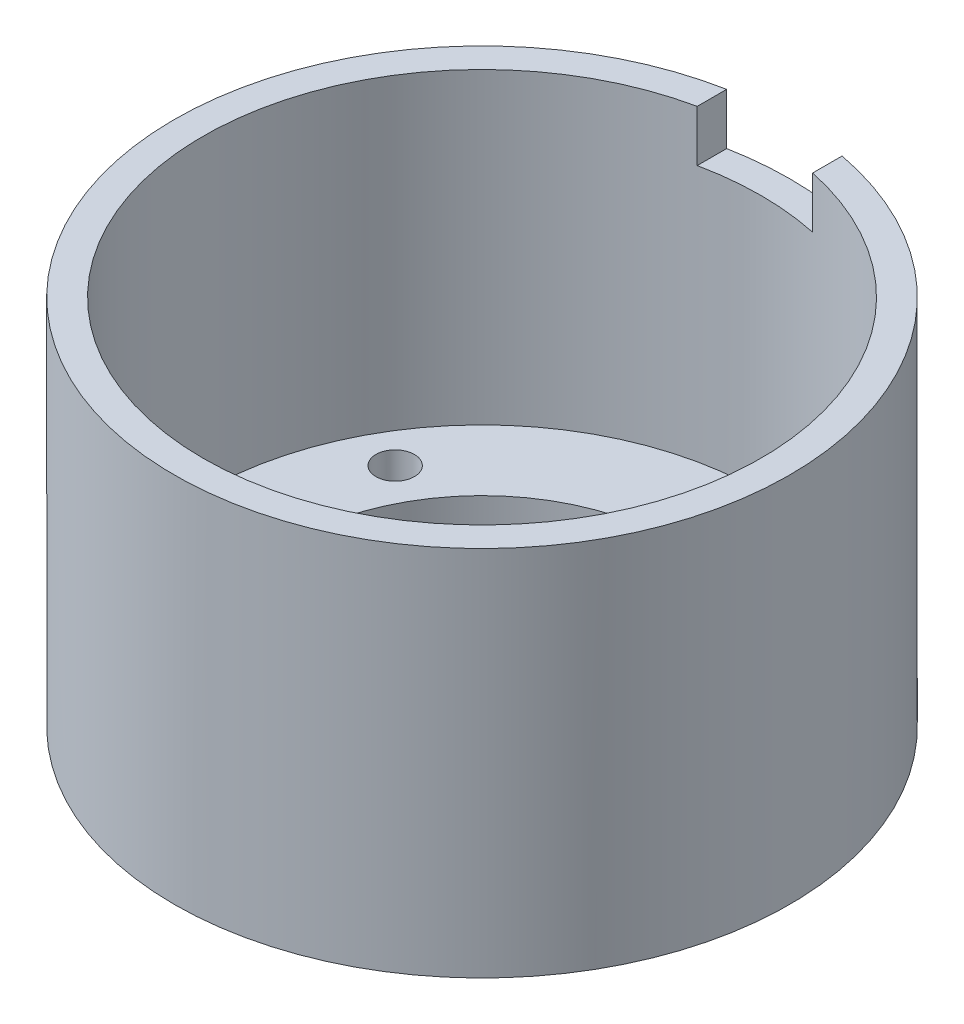
ISO-10303-21;
HEADER;
FILE_DESCRIPTION(('STEP AP214'),'2;1');
FILE_NAME('part.step','',(''),(''),'','','');
FILE_SCHEMA(('AUTOMOTIVE_DESIGN { 1 0 10303 214 1 1 1 1 }'));
ENDSEC;
DATA;
#1=APPLICATION_CONTEXT('core data for automotive mechanical design processes');
#2=APPLICATION_PROTOCOL_DEFINITION('international standard','automotive_design',2000,#1);
#3=PRODUCT_CONTEXT('',#1,'mechanical');
#4=PRODUCT('Part','Part','',(#3));
#5=PRODUCT_RELATED_PRODUCT_CATEGORY('part','',(#4));
#6=PRODUCT_DEFINITION_FORMATION('','',#4);
#7=PRODUCT_DEFINITION_CONTEXT('part definition',#1,'design');
#8=PRODUCT_DEFINITION('design','',#6,#7);
#9=PRODUCT_DEFINITION_SHAPE('','',#8);
#10=(LENGTH_UNIT() NAMED_UNIT(*) SI_UNIT(.MILLI.,.METRE.));
#11=(NAMED_UNIT(*) PLANE_ANGLE_UNIT() SI_UNIT($,.RADIAN.));
#12=(NAMED_UNIT(*) SI_UNIT($,.STERADIAN.) SOLID_ANGLE_UNIT());
#13=UNCERTAINTY_MEASURE_WITH_UNIT(LENGTH_MEASURE(1.E-05),#10,'distance_accuracy_value','');
#14=(GEOMETRIC_REPRESENTATION_CONTEXT(3) GLOBAL_UNCERTAINTY_ASSIGNED_CONTEXT((#13)) GLOBAL_UNIT_ASSIGNED_CONTEXT((#10,
#11,#12)) REPRESENTATION_CONTEXT('',''));
#15=CARTESIAN_POINT('',(0.,0.,0.));
#16=DIRECTION('',(0.,0.,1.));
#17=DIRECTION('',(1.,0.,0.));
#18=AXIS2_PLACEMENT_3D('',#15,#16,#17);
#19=CARTESIAN_POINT('',(0.,24.,0.));
#20=DIRECTION('',(0.,1.,0.));
#21=DIRECTION('',(0.,0.,1.));
#22=AXIS2_PLACEMENT_3D('',#19,#20,#21);
#23=PLANE('',#22);
#24=DIRECTION('',(0.,0.,-1.));
#25=VECTOR('',#24,1.);
#26=CARTESIAN_POINT('',(-4.5,24.,24.001));
#27=LINE('',#26,#25);
#28=CARTESIAN_POINT('',(-4.5,24.,-21.2793914386667));
#29=VERTEX_POINT('',#28);
#30=CARTESIAN_POINT('',(-4.5,24.,-23.5743504682526));
#31=VERTEX_POINT('',#30);
#32=EDGE_CURVE('E90',#29,#31,#27,.T.);
#33=ORIENTED_EDGE('',*,*,#32,.T.);
#34=CARTESIAN_POINT('',(0.,24.,0.));
#35=DIRECTION('',(0.,1.,0.));
#36=DIRECTION('',(0.,0.,1.));
#37=AXIS2_PLACEMENT_3D('',#34,#35,#36);
#38=CIRCLE('',#37,24.);
#39=CARTESIAN_POINT('',(4.5,24.,-23.5743504682526));
#40=VERTEX_POINT('',#39);
#41=EDGE_CURVE('E11',#31,#40,#38,.T.);
#42=ORIENTED_EDGE('',*,*,#41,.T.);
#43=DIRECTION('',(0.,0.,-1.));
#44=VECTOR('',#43,1.);
#45=CARTESIAN_POINT('',(4.5,24.,24.001));
#46=LINE('',#45,#44);
#47=CARTESIAN_POINT('',(4.5,24.,-21.2793914386667));
#48=VERTEX_POINT('',#47);
#49=EDGE_CURVE('E105',#48,#40,#46,.T.);
#50=ORIENTED_EDGE('',*,*,#49,.F.);
#51=CARTESIAN_POINT('',(0.,24.,0.));
#52=DIRECTION('',(0.,1.,0.));
#53=DIRECTION('',(0.,0.,1.));
#54=AXIS2_PLACEMENT_3D('',#51,#52,#53);
#55=CIRCLE('',#54,21.75);
#56=EDGE_CURVE('E51',#29,#48,#55,.T.);
#57=ORIENTED_EDGE('',*,*,#56,.F.);
#58=EDGE_LOOP('',(#33,#42,#50,#57));
#59=FACE_BOUND('',#58,.T.);
#60=ADVANCED_FACE('F42',(#59),#23,.T.);
#61=CARTESIAN_POINT('',(0.,24.,0.));
#62=DIRECTION('',(0.,-1.,0.));
#63=DIRECTION('',(0.,0.,-1.));
#64=AXIS2_PLACEMENT_3D('',#61,#62,#63);
#65=CYLINDRICAL_SURFACE('',#64,24.);
#66=DIRECTION('',(0.,-1.,0.));
#67=VECTOR('',#66,1.);
#68=CARTESIAN_POINT('',(-4.5,24.,-23.5743504682526));
#69=LINE('',#68,#67);
#70=CARTESIAN_POINT('',(-4.5,20.,-23.5743504682526));
#71=VERTEX_POINT('',#70);
#72=EDGE_CURVE('E113',#31,#71,#69,.T.);
#73=ORIENTED_EDGE('',*,*,#72,.T.);
#74=CARTESIAN_POINT('',(0.,20.,0.));
#75=DIRECTION('',(0.,-1.,0.));
#76=DIRECTION('',(0.,0.,-1.));
#77=AXIS2_PLACEMENT_3D('',#74,#75,#76);
#78=CIRCLE('',#77,24.);
#79=CARTESIAN_POINT('',(4.5,20.,-23.5743504682526));
#80=VERTEX_POINT('',#79);
#81=EDGE_CURVE('E66',#71,#80,#78,.T.);
#82=ORIENTED_EDGE('',*,*,#81,.T.);
#83=DIRECTION('',(0.,-1.,0.));
#84=VECTOR('',#83,1.);
#85=CARTESIAN_POINT('',(4.5,24.,-23.5743504682526));
#86=LINE('',#85,#84);
#87=EDGE_CURVE('E108',#80,#40,#86,.F.);
#88=ORIENTED_EDGE('',*,*,#87,.T.);
#89=ORIENTED_EDGE('',*,*,#41,.F.);
#90=EDGE_LOOP('',(#73,#82,#88,#89));
#91=FACE_BOUND('',#90,.T.);
#92=CARTESIAN_POINT('',(0.,-5.,0.));
#93=DIRECTION('',(0.,-1.,0.));
#94=DIRECTION('',(0.,0.,-1.));
#95=AXIS2_PLACEMENT_3D('',#92,#93,#94);
#96=CIRCLE('',#95,24.);
#97=CARTESIAN_POINT('',(0.,-5.,-24.));
#98=VERTEX_POINT('',#97);
#99=EDGE_CURVE('E148',#98,#98,#96,.T.);
#100=ORIENTED_EDGE('',*,*,#99,.F.);
#101=EDGE_LOOP('',(#100));
#102=FACE_BOUND('',#101,.T.);
#103=ADVANCED_FACE('F44',(#91,#102),#65,.T.);
#104=CARTESIAN_POINT('',(0.,24.,0.));
#105=DIRECTION('',(0.,-1.,0.));
#106=DIRECTION('',(0.,0.,-1.));
#107=AXIS2_PLACEMENT_3D('',#104,#105,#106);
#108=CYLINDRICAL_SURFACE('',#107,21.75);
#109=DIRECTION('',(0.,-1.,0.));
#110=VECTOR('',#109,1.);
#111=CARTESIAN_POINT('',(-4.5,24.,-21.2793914386667));
#112=LINE('',#111,#110);
#113=CARTESIAN_POINT('',(-4.5,20.,-21.2793914386667));
#114=VERTEX_POINT('',#113);
#115=EDGE_CURVE('E85',#114,#29,#112,.F.);
#116=ORIENTED_EDGE('',*,*,#115,.T.);
#117=ORIENTED_EDGE('',*,*,#56,.T.);
#118=DIRECTION('',(0.,-1.,0.));
#119=VECTOR('',#118,1.);
#120=CARTESIAN_POINT('',(4.5,24.,-21.2793914386667));
#121=LINE('',#120,#119);
#122=CARTESIAN_POINT('',(4.5,20.,-21.2793914386667));
#123=VERTEX_POINT('',#122);
#124=EDGE_CURVE('E102',#48,#123,#121,.T.);
#125=ORIENTED_EDGE('',*,*,#124,.T.);
#126=CARTESIAN_POINT('',(0.,20.,0.));
#127=DIRECTION('',(0.,-1.,0.));
#128=DIRECTION('',(0.,0.,-1.));
#129=AXIS2_PLACEMENT_3D('',#126,#127,#128);
#130=CIRCLE('',#129,21.75);
#131=EDGE_CURVE('E97',#123,#114,#130,.F.);
#132=ORIENTED_EDGE('',*,*,#131,.T.);
#133=EDGE_LOOP('',(#116,#117,#125,#132));
#134=FACE_BOUND('',#133,.T.);
#135=CARTESIAN_POINT('',(0.,0.,0.));
#136=DIRECTION('',(0.,1.,0.));
#137=DIRECTION('',(0.,0.,1.));
#138=AXIS2_PLACEMENT_3D('',#135,#136,#137);
#139=CIRCLE('',#138,21.75);
#140=CARTESIAN_POINT('',(0.,0.,21.75));
#141=VERTEX_POINT('',#140);
#142=EDGE_CURVE('E153',#141,#141,#139,.T.);
#143=ORIENTED_EDGE('',*,*,#142,.F.);
#144=EDGE_LOOP('',(#143));
#145=FACE_BOUND('',#144,.T.);
#146=ADVANCED_FACE('F100',(#134,#145),#108,.F.);
#147=CARTESIAN_POINT('',(0.,0.,0.));
#148=DIRECTION('',(0.,-1.,0.));
#149=DIRECTION('',(0.,0.,-1.));
#150=AXIS2_PLACEMENT_3D('',#147,#148,#149);
#151=PLANE('',#150);
#152=CARTESIAN_POINT('',(0.,0.,18.5));
#153=DIRECTION('',(0.,-1.,0.));
#154=DIRECTION('',(0.,0.,-1.));
#155=AXIS2_PLACEMENT_3D('',#152,#153,#154);
#156=CIRCLE('',#155,1.5);
#157=CARTESIAN_POINT('',(0.,0.,17.));
#158=VERTEX_POINT('',#157);
#159=EDGE_CURVE('E46',#158,#158,#156,.T.);
#160=ORIENTED_EDGE('',*,*,#159,.T.);
#161=EDGE_LOOP('',(#160));
#162=FACE_BOUND('',#161,.T.);
#163=CARTESIAN_POINT('',(16.0214699700121,0.,-9.24999999999999));
#164=DIRECTION('',(0.,-1.,0.));
#165=DIRECTION('',(0.,0.,-1.));
#166=AXIS2_PLACEMENT_3D('',#163,#164,#165);
#167=CIRCLE('',#166,1.5);
#168=CARTESIAN_POINT('',(16.0214699700121,0.,-10.75));
#169=VERTEX_POINT('',#168);
#170=EDGE_CURVE('E158',#169,#169,#167,.T.);
#171=ORIENTED_EDGE('',*,*,#170,.T.);
#172=EDGE_LOOP('',(#171));
#173=FACE_BOUND('',#172,.T.);
#174=CARTESIAN_POINT('',(-16.0214699700122,0.,-9.24999999999985));
#175=DIRECTION('',(0.,-1.,0.));
#176=DIRECTION('',(0.,0.,-1.));
#177=AXIS2_PLACEMENT_3D('',#174,#175,#176);
#178=CIRCLE('',#177,1.5);
#179=CARTESIAN_POINT('',(-16.0214699700122,0.,-10.7499999999999));
#180=VERTEX_POINT('',#179);
#181=EDGE_CURVE('E120',#180,#180,#178,.T.);
#182=ORIENTED_EDGE('',*,*,#181,.T.);
#183=EDGE_LOOP('',(#182));
#184=FACE_BOUND('',#183,.T.);
#185=CARTESIAN_POINT('',(0.,0.,0.));
#186=DIRECTION('',(0.,-1.,0.));
#187=DIRECTION('',(0.,0.,-1.));
#188=AXIS2_PLACEMENT_3D('',#185,#186,#187);
#189=CIRCLE('',#188,15.);
#190=CARTESIAN_POINT('',(0.,0.,-15.));
#191=VERTEX_POINT('',#190);
#192=EDGE_CURVE('E129',#191,#191,#189,.T.);
#193=ORIENTED_EDGE('',*,*,#192,.T.);
#194=EDGE_LOOP('',(#193));
#195=FACE_BOUND('',#194,.T.);
#196=ORIENTED_EDGE('',*,*,#142,.T.);
#197=EDGE_LOOP('',(#196));
#198=FACE_BOUND('',#197,.T.);
#199=ADVANCED_FACE('F165',(#162,#173,#184,#195,#198),#151,.F.);
#200=CARTESIAN_POINT('',(0.,-5.,0.));
#201=DIRECTION('',(0.,-1.,0.));
#202=DIRECTION('',(0.,0.,-1.));
#203=AXIS2_PLACEMENT_3D('',#200,#201,#202);
#204=PLANE('',#203);
#205=CARTESIAN_POINT('',(0.,-5.,18.5));
#206=DIRECTION('',(0.,-1.,0.));
#207=DIRECTION('',(0.,0.,-1.));
#208=AXIS2_PLACEMENT_3D('',#205,#206,#207);
#209=CIRCLE('',#208,2.5);
#210=CARTESIAN_POINT('',(0.,-5.,16.));
#211=VERTEX_POINT('',#210);
#212=EDGE_CURVE('E130',#211,#211,#209,.T.);
#213=ORIENTED_EDGE('',*,*,#212,.F.);
#214=EDGE_LOOP('',(#213));
#215=FACE_BOUND('',#214,.T.);
#216=CARTESIAN_POINT('',(16.0214699700121,-5.,-9.24999999999999));
#217=DIRECTION('',(0.,-1.,0.));
#218=DIRECTION('',(0.,0.,-1.));
#219=AXIS2_PLACEMENT_3D('',#216,#217,#218);
#220=CIRCLE('',#219,2.5);
#221=CARTESIAN_POINT('',(16.0214699700121,-5.,-11.75));
#222=VERTEX_POINT('',#221);
#223=EDGE_CURVE('E133',#222,#222,#220,.T.);
#224=ORIENTED_EDGE('',*,*,#223,.F.);
#225=EDGE_LOOP('',(#224));
#226=FACE_BOUND('',#225,.T.);
#227=CARTESIAN_POINT('',(-16.0214699700122,-5.,-9.24999999999985));
#228=DIRECTION('',(0.,-1.,0.));
#229=DIRECTION('',(0.,0.,-1.));
#230=AXIS2_PLACEMENT_3D('',#227,#228,#229);
#231=CIRCLE('',#230,2.5);
#232=CARTESIAN_POINT('',(-16.0214699700122,-5.,-11.7499999999998));
#233=VERTEX_POINT('',#232);
#234=EDGE_CURVE('E139',#233,#233,#231,.T.);
#235=ORIENTED_EDGE('',*,*,#234,.F.);
#236=EDGE_LOOP('',(#235));
#237=FACE_BOUND('',#236,.T.);
#238=ORIENTED_EDGE('',*,*,#99,.T.);
#239=EDGE_LOOP('',(#238));
#240=FACE_BOUND('',#239,.T.);
#241=CARTESIAN_POINT('',(0.,-5.,0.));
#242=DIRECTION('',(0.,-1.,0.));
#243=DIRECTION('',(0.,0.,-1.));
#244=AXIS2_PLACEMENT_3D('',#241,#242,#243);
#245=CIRCLE('',#244,15.);
#246=CARTESIAN_POINT('',(0.,-5.,-15.));
#247=VERTEX_POINT('',#246);
#248=EDGE_CURVE('E145',#247,#247,#245,.T.);
#249=ORIENTED_EDGE('',*,*,#248,.F.);
#250=EDGE_LOOP('',(#249));
#251=FACE_BOUND('',#250,.T.);
#252=ADVANCED_FACE('F192',(#215,#226,#237,#240,#251),#204,.T.);
#253=CARTESIAN_POINT('',(0.,-5.,0.));
#254=DIRECTION('',(0.,1.,0.));
#255=DIRECTION('',(0.,0.,1.));
#256=AXIS2_PLACEMENT_3D('',#253,#254,#255);
#257=CYLINDRICAL_SURFACE('',#256,15.);
#258=ORIENTED_EDGE('',*,*,#248,.T.);
#259=EDGE_LOOP('',(#258));
#260=FACE_BOUND('',#259,.T.);
#261=ORIENTED_EDGE('',*,*,#192,.F.);
#262=EDGE_LOOP('',(#261));
#263=FACE_BOUND('',#262,.T.);
#264=ADVANCED_FACE('F195',(#260,#263),#257,.F.);
#265=CARTESIAN_POINT('',(-16.0214699700122,-3.,-9.24999999999985));
#266=DIRECTION('',(0.,-1.,0.));
#267=DIRECTION('',(0.,0.,-1.));
#268=AXIS2_PLACEMENT_3D('',#265,#266,#267);
#269=CYLINDRICAL_SURFACE('',#268,2.5);
#270=CARTESIAN_POINT('',(-16.0214699700122,-3.,-9.24999999999985));
#271=DIRECTION('',(0.,-1.,0.));
#272=DIRECTION('',(0.,0.,-1.));
#273=AXIS2_PLACEMENT_3D('',#270,#271,#272);
#274=CIRCLE('',#273,2.5);
#275=CARTESIAN_POINT('',(-16.0214699700122,-3.,-11.7499999999998));
#276=VERTEX_POINT('',#275);
#277=EDGE_CURVE('E142',#276,#276,#274,.T.);
#278=ORIENTED_EDGE('',*,*,#277,.F.);
#279=EDGE_LOOP('',(#278));
#280=FACE_BOUND('',#279,.T.);
#281=ORIENTED_EDGE('',*,*,#234,.T.);
#282=EDGE_LOOP('',(#281));
#283=FACE_BOUND('',#282,.T.);
#284=ADVANCED_FACE('F199',(#280,#283),#269,.F.);
#285=CARTESIAN_POINT('',(-16.0214699700122,-3.,-9.24999999999985));
#286=DIRECTION('',(0.,-1.,0.));
#287=DIRECTION('',(0.,0.,-1.));
#288=AXIS2_PLACEMENT_3D('',#285,#286,#287);
#289=PLANE('',#288);
#290=CARTESIAN_POINT('',(-16.0214699700122,-3.,-9.24999999999985));
#291=DIRECTION('',(0.,-1.,0.));
#292=DIRECTION('',(0.,0.,-1.));
#293=AXIS2_PLACEMENT_3D('',#290,#291,#292);
#294=CIRCLE('',#293,1.5);
#295=CARTESIAN_POINT('',(-16.0214699700122,-3.,-10.7499999999999));
#296=VERTEX_POINT('',#295);
#297=EDGE_CURVE('E116',#296,#296,#294,.T.);
#298=ORIENTED_EDGE('',*,*,#297,.F.);
#299=EDGE_LOOP('',(#298));
#300=FACE_BOUND('',#299,.T.);
#301=ORIENTED_EDGE('',*,*,#277,.T.);
#302=EDGE_LOOP('',(#301));
#303=FACE_BOUND('',#302,.T.);
#304=ADVANCED_FACE('F201',(#300,#303),#289,.T.);
#305=CARTESIAN_POINT('',(16.0214699700121,-3.,-9.24999999999999));
#306=DIRECTION('',(0.,-1.,0.));
#307=DIRECTION('',(0.,0.,-1.));
#308=AXIS2_PLACEMENT_3D('',#305,#306,#307);
#309=CYLINDRICAL_SURFACE('',#308,2.5);
#310=CARTESIAN_POINT('',(16.0214699700121,-3.,-9.24999999999999));
#311=DIRECTION('',(0.,-1.,0.));
#312=DIRECTION('',(0.,0.,-1.));
#313=AXIS2_PLACEMENT_3D('',#310,#311,#312);
#314=CIRCLE('',#313,2.5);
#315=CARTESIAN_POINT('',(16.0214699700121,-3.,-11.75));
#316=VERTEX_POINT('',#315);
#317=EDGE_CURVE('E136',#316,#316,#314,.T.);
#318=ORIENTED_EDGE('',*,*,#317,.F.);
#319=EDGE_LOOP('',(#318));
#320=FACE_BOUND('',#319,.T.);
#321=ORIENTED_EDGE('',*,*,#223,.T.);
#322=EDGE_LOOP('',(#321));
#323=FACE_BOUND('',#322,.T.);
#324=ADVANCED_FACE('F204',(#320,#323),#309,.F.);
#325=CARTESIAN_POINT('',(16.0214699700121,-3.,-9.24999999999999));
#326=DIRECTION('',(0.,-1.,0.));
#327=DIRECTION('',(0.,0.,-1.));
#328=AXIS2_PLACEMENT_3D('',#325,#326,#327);
#329=PLANE('',#328);
#330=CARTESIAN_POINT('',(16.0214699700121,-3.,-9.24999999999999));
#331=DIRECTION('',(0.,-1.,0.));
#332=DIRECTION('',(0.,0.,-1.));
#333=AXIS2_PLACEMENT_3D('',#330,#331,#332);
#334=CIRCLE('',#333,1.5);
#335=CARTESIAN_POINT('',(16.0214699700121,-3.,-10.75));
#336=VERTEX_POINT('',#335);
#337=EDGE_CURVE('E121',#336,#336,#334,.T.);
#338=ORIENTED_EDGE('',*,*,#337,.F.);
#339=EDGE_LOOP('',(#338));
#340=FACE_BOUND('',#339,.T.);
#341=ORIENTED_EDGE('',*,*,#317,.T.);
#342=EDGE_LOOP('',(#341));
#343=FACE_BOUND('',#342,.T.);
#344=ADVANCED_FACE('F209',(#340,#343),#329,.T.);
#345=CARTESIAN_POINT('',(0.,-3.,18.5));
#346=DIRECTION('',(0.,-1.,0.));
#347=DIRECTION('',(0.,0.,-1.));
#348=AXIS2_PLACEMENT_3D('',#345,#346,#347);
#349=CYLINDRICAL_SURFACE('',#348,2.5);
#350=CARTESIAN_POINT('',(0.,-3.,18.5));
#351=DIRECTION('',(0.,-1.,0.));
#352=DIRECTION('',(0.,0.,-1.));
#353=AXIS2_PLACEMENT_3D('',#350,#351,#352);
#354=CIRCLE('',#353,2.5);
#355=CARTESIAN_POINT('',(0.,-3.,16.));
#356=VERTEX_POINT('',#355);
#357=EDGE_CURVE('E126',#356,#356,#354,.T.);
#358=ORIENTED_EDGE('',*,*,#357,.F.);
#359=EDGE_LOOP('',(#358));
#360=FACE_BOUND('',#359,.T.);
#361=ORIENTED_EDGE('',*,*,#212,.T.);
#362=EDGE_LOOP('',(#361));
#363=FACE_BOUND('',#362,.T.);
#364=ADVANCED_FACE('F212',(#360,#363),#349,.F.);
#365=CARTESIAN_POINT('',(0.,-3.,18.5));
#366=DIRECTION('',(0.,-1.,0.));
#367=DIRECTION('',(0.,0.,-1.));
#368=AXIS2_PLACEMENT_3D('',#365,#366,#367);
#369=PLANE('',#368);
#370=CARTESIAN_POINT('',(0.,-3.,18.5));
#371=DIRECTION('',(0.,-1.,0.));
#372=DIRECTION('',(0.,0.,-1.));
#373=AXIS2_PLACEMENT_3D('',#370,#371,#372);
#374=CIRCLE('',#373,1.5);
#375=CARTESIAN_POINT('',(0.,-3.,17.));
#376=VERTEX_POINT('',#375);
#377=EDGE_CURVE('E117',#376,#376,#374,.T.);
#378=ORIENTED_EDGE('',*,*,#377,.F.);
#379=EDGE_LOOP('',(#378));
#380=FACE_BOUND('',#379,.T.);
#381=ORIENTED_EDGE('',*,*,#357,.T.);
#382=EDGE_LOOP('',(#381));
#383=FACE_BOUND('',#382,.T.);
#384=ADVANCED_FACE('F219',(#380,#383),#369,.T.);
#385=CARTESIAN_POINT('',(-16.0214699700122,24.,-9.24999999999985));
#386=DIRECTION('',(0.,-1.,0.));
#387=DIRECTION('',(0.,0.,-1.));
#388=AXIS2_PLACEMENT_3D('',#385,#386,#387);
#389=CYLINDRICAL_SURFACE('',#388,1.5);
#390=ORIENTED_EDGE('',*,*,#297,.T.);
#391=EDGE_LOOP('',(#390));
#392=FACE_BOUND('',#391,.T.);
#393=ORIENTED_EDGE('',*,*,#181,.F.);
#394=EDGE_LOOP('',(#393));
#395=FACE_BOUND('',#394,.T.);
#396=ADVANCED_FACE('F178',(#392,#395),#389,.F.);
#397=CARTESIAN_POINT('',(16.0214699700121,24.,-9.24999999999999));
#398=DIRECTION('',(0.,-1.,0.));
#399=DIRECTION('',(0.,0.,-1.));
#400=AXIS2_PLACEMENT_3D('',#397,#398,#399);
#401=CYLINDRICAL_SURFACE('',#400,1.5);
#402=ORIENTED_EDGE('',*,*,#337,.T.);
#403=EDGE_LOOP('',(#402));
#404=FACE_BOUND('',#403,.T.);
#405=ORIENTED_EDGE('',*,*,#170,.F.);
#406=EDGE_LOOP('',(#405));
#407=FACE_BOUND('',#406,.T.);
#408=ADVANCED_FACE('F169',(#404,#407),#401,.F.);
#409=CARTESIAN_POINT('',(0.,24.,18.5));
#410=DIRECTION('',(0.,-1.,0.));
#411=DIRECTION('',(0.,0.,-1.));
#412=AXIS2_PLACEMENT_3D('',#409,#410,#411);
#413=CYLINDRICAL_SURFACE('',#412,1.5);
#414=ORIENTED_EDGE('',*,*,#377,.T.);
#415=EDGE_LOOP('',(#414));
#416=FACE_BOUND('',#415,.T.);
#417=ORIENTED_EDGE('',*,*,#159,.F.);
#418=EDGE_LOOP('',(#417));
#419=FACE_BOUND('',#418,.T.);
#420=ADVANCED_FACE('F167',(#416,#419),#413,.F.);
#421=CARTESIAN_POINT('',(4.5,20.,24.001));
#422=DIRECTION('',(0.,-1.,0.));
#423=DIRECTION('',(0.,0.,-1.));
#424=AXIS2_PLACEMENT_3D('',#421,#422,#423);
#425=PLANE('',#424);
#426=ORIENTED_EDGE('',*,*,#81,.F.);
#427=DIRECTION('',(0.,0.,-1.));
#428=VECTOR('',#427,1.);
#429=CARTESIAN_POINT('',(-4.5,20.,24.001));
#430=LINE('',#429,#428);
#431=EDGE_CURVE('E87',#114,#71,#430,.T.);
#432=ORIENTED_EDGE('',*,*,#431,.F.);
#433=ORIENTED_EDGE('',*,*,#131,.F.);
#434=DIRECTION('',(0.,0.,-1.));
#435=VECTOR('',#434,1.);
#436=CARTESIAN_POINT('',(4.5,20.,24.001));
#437=LINE('',#436,#435);
#438=EDGE_CURVE('E59',#123,#80,#437,.T.);
#439=ORIENTED_EDGE('',*,*,#438,.T.);
#440=EDGE_LOOP('',(#426,#432,#433,#439));
#441=FACE_BOUND('',#440,.T.);
#442=ADVANCED_FACE('F96',(#441),#425,.F.);
#443=CARTESIAN_POINT('',(-4.5,24.,24.001));
#444=DIRECTION('',(-1.,0.,0.));
#445=DIRECTION('',(0.,0.,1.));
#446=AXIS2_PLACEMENT_3D('',#443,#444,#445);
#447=PLANE('',#446);
#448=ORIENTED_EDGE('',*,*,#32,.F.);
#449=ORIENTED_EDGE('',*,*,#115,.F.);
#450=ORIENTED_EDGE('',*,*,#431,.T.);
#451=ORIENTED_EDGE('',*,*,#72,.F.);
#452=EDGE_LOOP('',(#448,#449,#450,#451));
#453=FACE_BOUND('',#452,.T.);
#454=ADVANCED_FACE('F86',(#453),#447,.F.);
#455=CARTESIAN_POINT('',(4.5,24.,24.001));
#456=DIRECTION('',(1.,0.,0.));
#457=DIRECTION('',(0.,1.,0.));
#458=AXIS2_PLACEMENT_3D('',#455,#456,#457);
#459=PLANE('',#458);
#460=ORIENTED_EDGE('',*,*,#438,.F.);
#461=ORIENTED_EDGE('',*,*,#124,.F.);
#462=ORIENTED_EDGE('',*,*,#49,.T.);
#463=ORIENTED_EDGE('',*,*,#87,.F.);
#464=EDGE_LOOP('',(#460,#461,#462,#463));
#465=FACE_BOUND('',#464,.T.);
#466=ADVANCED_FACE('F274',(#465),#459,.F.);
#467=CLOSED_SHELL('',(#60,#103,#146,#199,#252,#264,#284,#304,#324,#344,#364,#384,#396,#408,#420,
#442,#454,#466));
#468=MANIFOLD_SOLID_BREP('B2',#467);
#469=ADVANCED_BREP_SHAPE_REPRESENTATION('',(#18,#468),#14);
#470=SHAPE_DEFINITION_REPRESENTATION(#9,#469);
ENDSEC;
END-ISO-10303-21;
